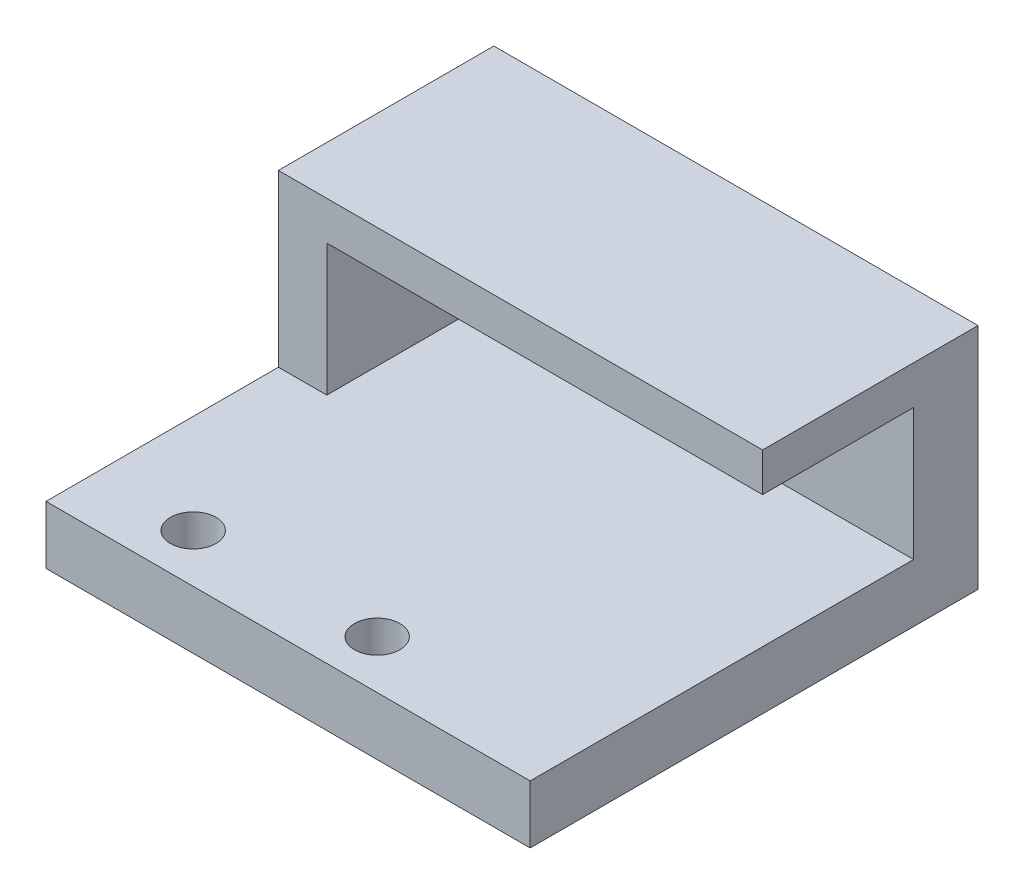
ISO-10303-21;
HEADER;
FILE_DESCRIPTION(('STEP AP214'),'2;1');
FILE_NAME('part.step','',(''),(''),'','','');
FILE_SCHEMA(('AUTOMOTIVE_DESIGN { 1 0 10303 214 1 1 1 1 }'));
ENDSEC;
DATA;
#1=APPLICATION_CONTEXT('core data for automotive mechanical design processes');
#2=APPLICATION_PROTOCOL_DEFINITION('international standard','automotive_design',2000,#1);
#3=PRODUCT_CONTEXT('',#1,'mechanical');
#4=PRODUCT('Part','Part','',(#3));
#5=PRODUCT_RELATED_PRODUCT_CATEGORY('part','',(#4));
#6=PRODUCT_DEFINITION_FORMATION('','',#4);
#7=PRODUCT_DEFINITION_CONTEXT('part definition',#1,'design');
#8=PRODUCT_DEFINITION('design','',#6,#7);
#9=PRODUCT_DEFINITION_SHAPE('','',#8);
#10=(LENGTH_UNIT() NAMED_UNIT(*) SI_UNIT(.MILLI.,.METRE.));
#11=(NAMED_UNIT(*) PLANE_ANGLE_UNIT() SI_UNIT($,.RADIAN.));
#12=(NAMED_UNIT(*) SI_UNIT($,.STERADIAN.) SOLID_ANGLE_UNIT());
#13=UNCERTAINTY_MEASURE_WITH_UNIT(LENGTH_MEASURE(1.E-05),#10,'distance_accuracy_value','');
#14=(GEOMETRIC_REPRESENTATION_CONTEXT(3) GLOBAL_UNCERTAINTY_ASSIGNED_CONTEXT((#13)) GLOBAL_UNIT_ASSIGNED_CONTEXT((#10,
#11,#12)) REPRESENTATION_CONTEXT('',''));
#15=CARTESIAN_POINT('',(0.,0.,0.));
#16=DIRECTION('',(0.,0.,1.));
#17=DIRECTION('',(1.,0.,0.));
#18=AXIS2_PLACEMENT_3D('',#15,#16,#17);
#19=CARTESIAN_POINT('',(0.,3.,0.));
#20=DIRECTION('',(0.,-1.,0.));
#21=DIRECTION('',(0.,0.,-1.));
#22=AXIS2_PLACEMENT_3D('',#19,#20,#21);
#23=PLANE('',#22);
#24=CARTESIAN_POINT('',(5.1,3.,-2.5));
#25=DIRECTION('',(0.,1.,0.));
#26=DIRECTION('',(0.,0.,1.));
#27=AXIS2_PLACEMENT_3D('',#24,#25,#26);
#28=CIRCLE('',#27,1.175);
#29=CARTESIAN_POINT('',(5.1,3.,-1.325));
#30=VERTEX_POINT('',#29);
#31=EDGE_CURVE('E203',#30,#30,#28,.T.);
#32=ORIENTED_EDGE('',*,*,#31,.F.);
#33=EDGE_LOOP('',(#32));
#34=FACE_BOUND('',#33,.T.);
#35=CARTESIAN_POINT('',(14.6,3.,-2.5));
#36=DIRECTION('',(0.,1.,0.));
#37=DIRECTION('',(0.,0.,1.));
#38=AXIS2_PLACEMENT_3D('',#35,#36,#37);
#39=CIRCLE('',#38,1.175);
#40=CARTESIAN_POINT('',(14.6,3.,-1.325));
#41=VERTEX_POINT('',#40);
#42=EDGE_CURVE('E195',#41,#41,#39,.T.);
#43=ORIENTED_EDGE('',*,*,#42,.F.);
#44=EDGE_LOOP('',(#43));
#45=FACE_BOUND('',#44,.T.);
#46=DIRECTION('',(-1.,0.,0.));
#47=VECTOR('',#46,1.);
#48=CARTESIAN_POINT('',(34.7590983190047,3.,-19.8));
#49=LINE('',#48,#47);
#50=CARTESIAN_POINT('',(25.,3.,-19.8));
#51=VERTEX_POINT('',#50);
#52=CARTESIAN_POINT('',(2.5,3.,-19.8));
#53=VERTEX_POINT('',#52);
#54=EDGE_CURVE('E166',#51,#53,#49,.T.);
#55=ORIENTED_EDGE('',*,*,#54,.T.);
#56=DIRECTION('',(0.,0.,-1.));
#57=VECTOR('',#56,1.);
#58=CARTESIAN_POINT('',(2.5,3.,-20.));
#59=LINE('',#58,#57);
#60=CARTESIAN_POINT('',(2.5,3.,-12.));
#61=VERTEX_POINT('',#60);
#62=EDGE_CURVE('E181',#61,#53,#59,.T.);
#63=ORIENTED_EDGE('',*,*,#62,.F.);
#64=DIRECTION('',(1.,0.,0.));
#65=VECTOR('',#64,1.);
#66=CARTESIAN_POINT('',(0.,3.,-12.));
#67=LINE('',#66,#65);
#68=CARTESIAN_POINT('',(0.,3.,-12.));
#69=VERTEX_POINT('',#68);
#70=EDGE_CURVE('E68',#69,#61,#67,.T.);
#71=ORIENTED_EDGE('',*,*,#70,.F.);
#72=DIRECTION('',(0.,0.,1.));
#73=VECTOR('',#72,1.);
#74=CARTESIAN_POINT('',(0.,3.,0.));
#75=LINE('',#74,#73);
#76=CARTESIAN_POINT('',(0.,3.,0.));
#77=VERTEX_POINT('',#76);
#78=EDGE_CURVE('E211',#69,#77,#75,.T.);
#79=ORIENTED_EDGE('',*,*,#78,.T.);
#80=DIRECTION('',(1.,0.,0.));
#81=VECTOR('',#80,1.);
#82=CARTESIAN_POINT('',(0.,3.,0.));
#83=LINE('',#82,#81);
#84=CARTESIAN_POINT('',(25.,3.,0.));
#85=VERTEX_POINT('',#84);
#86=EDGE_CURVE('E214',#77,#85,#83,.T.);
#87=ORIENTED_EDGE('',*,*,#86,.T.);
#88=DIRECTION('',(0.,0.,-1.));
#89=VECTOR('',#88,1.);
#90=CARTESIAN_POINT('',(25.,3.,0.));
#91=LINE('',#90,#89);
#92=EDGE_CURVE('E217',#85,#51,#91,.T.);
#93=ORIENTED_EDGE('',*,*,#92,.T.);
#94=EDGE_LOOP('',(#55,#63,#71,#79,#87,#93));
#95=FACE_BOUND('',#94,.T.);
#96=ADVANCED_FACE('F45',(#34,#45,#95),#23,.F.);
#97=CARTESIAN_POINT('',(2.5,9.8,-20.));
#98=DIRECTION('',(-1.,0.,0.));
#99=DIRECTION('',(0.,0.,1.));
#100=AXIS2_PLACEMENT_3D('',#97,#98,#99);
#101=PLANE('',#100);
#102=DIRECTION('',(0.,-1.,0.));
#103=VECTOR('',#102,1.);
#104=CARTESIAN_POINT('',(2.5,9.8,-19.8));
#105=LINE('',#104,#103);
#106=CARTESIAN_POINT('',(2.5,9.8,-19.8));
#107=VERTEX_POINT('',#106);
#108=CARTESIAN_POINT('',(2.5,6.4,-19.8));
#109=VERTEX_POINT('',#108);
#110=EDGE_CURVE('E163',#107,#109,#105,.T.);
#111=ORIENTED_EDGE('',*,*,#110,.F.);
#112=DIRECTION('',(0.,0.,-1.));
#113=VECTOR('',#112,1.);
#114=CARTESIAN_POINT('',(2.5,9.8,-20.));
#115=LINE('',#114,#113);
#116=CARTESIAN_POINT('',(2.5,9.8,-12.));
#117=VERTEX_POINT('',#116);
#118=EDGE_CURVE('E177',#117,#107,#115,.T.);
#119=ORIENTED_EDGE('',*,*,#118,.F.);
#120=DIRECTION('',(0.,-1.,0.));
#121=VECTOR('',#120,1.);
#122=CARTESIAN_POINT('',(2.5,9.8,-12.));
#123=LINE('',#122,#121);
#124=EDGE_CURVE('E180',#117,#61,#123,.T.);
#125=ORIENTED_EDGE('',*,*,#124,.T.);
#126=ORIENTED_EDGE('',*,*,#62,.T.);
#127=EDGE_CURVE('E144',#109,#53,#105,.T.);
#128=ORIENTED_EDGE('',*,*,#127,.F.);
#129=CARTESIAN_POINT('',(2.5,6.4,-18.));
#130=DIRECTION('',(-1.,0.,0.));
#131=DIRECTION('',(0.,0.,1.));
#132=AXIS2_PLACEMENT_3D('',#129,#130,#131);
#133=CIRCLE('',#132,1.8);
#134=EDGE_CURVE('E176',#109,#109,#133,.T.);
#135=ORIENTED_EDGE('',*,*,#134,.T.);
#136=EDGE_LOOP('',(#111,#119,#125,#126,#128,#135));
#137=FACE_BOUND('',#136,.T.);
#138=ADVANCED_FACE('F239',(#137),#101,.F.);
#139=CARTESIAN_POINT('',(0.,0.,0.));
#140=DIRECTION('',(0.,-1.,0.));
#141=DIRECTION('',(0.,0.,-1.));
#142=AXIS2_PLACEMENT_3D('',#139,#140,#141);
#143=PLANE('',#142);
#144=DIRECTION('',(1.,0.,0.));
#145=VECTOR('',#144,1.);
#146=CARTESIAN_POINT('',(-11.,0.,-23.1239864451254));
#147=LINE('',#146,#145);
#148=CARTESIAN_POINT('',(0.,0.,-23.1239864451254));
#149=VERTEX_POINT('',#148);
#150=CARTESIAN_POINT('',(25.,0.,-23.1239864451254));
#151=VERTEX_POINT('',#150);
#152=EDGE_CURVE('E133',#149,#151,#147,.T.);
#153=ORIENTED_EDGE('',*,*,#152,.T.);
#154=DIRECTION('',(0.,0.,-1.));
#155=VECTOR('',#154,1.);
#156=CARTESIAN_POINT('',(25.,0.,0.));
#157=LINE('',#156,#155);
#158=CARTESIAN_POINT('',(25.,0.,0.));
#159=VERTEX_POINT('',#158);
#160=EDGE_CURVE('E131',#159,#151,#157,.T.);
#161=ORIENTED_EDGE('',*,*,#160,.F.);
#162=DIRECTION('',(1.,0.,0.));
#163=VECTOR('',#162,1.);
#164=CARTESIAN_POINT('',(0.,0.,0.));
#165=LINE('',#164,#163);
#166=CARTESIAN_POINT('',(0.,0.,0.));
#167=VERTEX_POINT('',#166);
#168=EDGE_CURVE('E224',#167,#159,#165,.T.);
#169=ORIENTED_EDGE('',*,*,#168,.F.);
#170=DIRECTION('',(0.,0.,1.));
#171=VECTOR('',#170,1.);
#172=CARTESIAN_POINT('',(0.,0.,0.));
#173=LINE('',#172,#171);
#174=EDGE_CURVE('E207',#149,#167,#173,.T.);
#175=ORIENTED_EDGE('',*,*,#174,.F.);
#176=EDGE_LOOP('',(#153,#161,#169,#175));
#177=FACE_BOUND('',#176,.T.);
#178=CARTESIAN_POINT('',(5.1,0.,-2.5));
#179=DIRECTION('',(0.,1.,0.));
#180=DIRECTION('',(0.,0.,1.));
#181=AXIS2_PLACEMENT_3D('',#178,#179,#180);
#182=CIRCLE('',#181,1.175);
#183=CARTESIAN_POINT('',(5.1,0.,-1.325));
#184=VERTEX_POINT('',#183);
#185=EDGE_CURVE('E199',#184,#184,#182,.T.);
#186=ORIENTED_EDGE('',*,*,#185,.T.);
#187=EDGE_LOOP('',(#186));
#188=FACE_BOUND('',#187,.T.);
#189=CARTESIAN_POINT('',(14.6,0.,-2.5));
#190=DIRECTION('',(0.,1.,0.));
#191=DIRECTION('',(0.,0.,1.));
#192=AXIS2_PLACEMENT_3D('',#189,#190,#191);
#193=CIRCLE('',#192,1.175);
#194=CARTESIAN_POINT('',(14.6,0.,-1.325));
#195=VERTEX_POINT('',#194);
#196=EDGE_CURVE('E194',#195,#195,#193,.T.);
#197=ORIENTED_EDGE('',*,*,#196,.T.);
#198=EDGE_LOOP('',(#197));
#199=FACE_BOUND('',#198,.T.);
#200=ADVANCED_FACE('F265',(#177,#188,#199),#143,.T.);
#201=CARTESIAN_POINT('',(0.,3.,0.));
#202=DIRECTION('',(1.,0.,0.));
#203=DIRECTION('',(0.,0.,-1.));
#204=AXIS2_PLACEMENT_3D('',#201,#202,#203);
#205=PLANE('',#204);
#206=CARTESIAN_POINT('',(0.,6.4,-18.));
#207=DIRECTION('',(-1.,0.,0.));
#208=DIRECTION('',(0.,0.,1.));
#209=AXIS2_PLACEMENT_3D('',#206,#207,#208);
#210=CIRCLE('',#209,1.8);
#211=CARTESIAN_POINT('',(0.,6.4,-16.2));
#212=VERTEX_POINT('',#211);
#213=EDGE_CURVE('E161',#212,#212,#210,.T.);
#214=ORIENTED_EDGE('',*,*,#213,.F.);
#215=EDGE_LOOP('',(#214));
#216=FACE_BOUND('',#215,.T.);
#217=DIRECTION('',(0.,0.,1.));
#218=VECTOR('',#217,1.);
#219=CARTESIAN_POINT('',(0.,11.8,-12.));
#220=LINE('',#219,#218);
#221=CARTESIAN_POINT('',(0.,11.8,-23.1239864451254));
#222=VERTEX_POINT('',#221);
#223=CARTESIAN_POINT('',(0.,11.8,-12.));
#224=VERTEX_POINT('',#223);
#225=EDGE_CURVE('E146',#222,#224,#220,.T.);
#226=ORIENTED_EDGE('',*,*,#225,.F.);
#227=DIRECTION('',(0.,-1.,0.));
#228=VECTOR('',#227,1.);
#229=CARTESIAN_POINT('',(0.,3.,-23.1239864451254));
#230=LINE('',#229,#228);
#231=EDGE_CURVE('E61',#222,#149,#230,.T.);
#232=ORIENTED_EDGE('',*,*,#231,.T.);
#233=ORIENTED_EDGE('',*,*,#174,.T.);
#234=DIRECTION('',(0.,-1.,0.));
#235=VECTOR('',#234,1.);
#236=CARTESIAN_POINT('',(0.,3.,0.));
#237=LINE('',#236,#235);
#238=EDGE_CURVE('E54',#77,#167,#237,.T.);
#239=ORIENTED_EDGE('',*,*,#238,.F.);
#240=ORIENTED_EDGE('',*,*,#78,.F.);
#241=DIRECTION('',(0.,-1.,0.));
#242=VECTOR('',#241,1.);
#243=CARTESIAN_POINT('',(0.,9.8,-12.));
#244=LINE('',#243,#242);
#245=EDGE_CURVE('E190',#224,#69,#244,.T.);
#246=ORIENTED_EDGE('',*,*,#245,.F.);
#247=EDGE_LOOP('',(#226,#232,#233,#239,#240,#246));
#248=FACE_BOUND('',#247,.T.);
#249=ADVANCED_FACE('F47',(#216,#248),#205,.F.);
#250=CARTESIAN_POINT('',(0.,3.,0.));
#251=DIRECTION('',(0.,0.,-1.));
#252=DIRECTION('',(-1.,0.,0.));
#253=AXIS2_PLACEMENT_3D('',#250,#251,#252);
#254=PLANE('',#253);
#255=ORIENTED_EDGE('',*,*,#168,.T.);
#256=DIRECTION('',(0.,-1.,0.));
#257=VECTOR('',#256,1.);
#258=CARTESIAN_POINT('',(25.,3.,0.));
#259=LINE('',#258,#257);
#260=EDGE_CURVE('E221',#85,#159,#259,.T.);
#261=ORIENTED_EDGE('',*,*,#260,.F.);
#262=ORIENTED_EDGE('',*,*,#86,.F.);
#263=ORIENTED_EDGE('',*,*,#238,.T.);
#264=EDGE_LOOP('',(#255,#261,#262,#263));
#265=FACE_BOUND('',#264,.T.);
#266=ADVANCED_FACE('F276',(#265),#254,.F.);
#267=CARTESIAN_POINT('',(25.,3.,0.));
#268=DIRECTION('',(-1.,0.,0.));
#269=DIRECTION('',(0.,0.,1.));
#270=AXIS2_PLACEMENT_3D('',#267,#268,#269);
#271=PLANE('',#270);
#272=ORIENTED_EDGE('',*,*,#160,.T.);
#273=DIRECTION('',(0.,-1.,0.));
#274=VECTOR('',#273,1.);
#275=CARTESIAN_POINT('',(25.,11.8,-23.1239864451254));
#276=LINE('',#275,#274);
#277=CARTESIAN_POINT('',(25.,11.8,-23.1239864451254));
#278=VERTEX_POINT('',#277);
#279=EDGE_CURVE('E118',#278,#151,#276,.T.);
#280=ORIENTED_EDGE('',*,*,#279,.F.);
#281=DIRECTION('',(0.,0.,-1.));
#282=VECTOR('',#281,1.);
#283=CARTESIAN_POINT('',(25.,11.8,-12.));
#284=LINE('',#283,#282);
#285=CARTESIAN_POINT('',(25.,11.8,-12.));
#286=VERTEX_POINT('',#285);
#287=EDGE_CURVE('E128',#286,#278,#284,.T.);
#288=ORIENTED_EDGE('',*,*,#287,.F.);
#289=DIRECTION('',(0.,-1.,0.));
#290=VECTOR('',#289,1.);
#291=CARTESIAN_POINT('',(25.,11.8,-12.));
#292=LINE('',#291,#290);
#293=CARTESIAN_POINT('',(25.,9.8,-12.));
#294=VERTEX_POINT('',#293);
#295=EDGE_CURVE('E140',#286,#294,#292,.T.);
#296=ORIENTED_EDGE('',*,*,#295,.T.);
#297=DIRECTION('',(0.,0.,-1.));
#298=VECTOR('',#297,1.);
#299=CARTESIAN_POINT('',(25.,9.8,-12.));
#300=LINE('',#299,#298);
#301=CARTESIAN_POINT('',(25.,9.8,-19.8));
#302=VERTEX_POINT('',#301);
#303=EDGE_CURVE('E153',#294,#302,#300,.T.);
#304=ORIENTED_EDGE('',*,*,#303,.T.);
#305=DIRECTION('',(0.,1.,0.));
#306=VECTOR('',#305,1.);
#307=CARTESIAN_POINT('',(25.,9.8,-19.8));
#308=LINE('',#307,#306);
#309=EDGE_CURVE('E157',#51,#302,#308,.T.);
#310=ORIENTED_EDGE('',*,*,#309,.F.);
#311=ORIENTED_EDGE('',*,*,#92,.F.);
#312=ORIENTED_EDGE('',*,*,#260,.T.);
#313=EDGE_LOOP('',(#272,#280,#288,#296,#304,#310,#311,#312));
#314=FACE_BOUND('',#313,.T.);
#315=ADVANCED_FACE('F126',(#314),#271,.F.);
#316=CARTESIAN_POINT('',(5.1,3.,-2.5));
#317=DIRECTION('',(0.,-1.,0.));
#318=DIRECTION('',(0.,0.,-1.));
#319=AXIS2_PLACEMENT_3D('',#316,#317,#318);
#320=CYLINDRICAL_SURFACE('',#319,1.175);
#321=ORIENTED_EDGE('',*,*,#31,.T.);
#322=EDGE_LOOP('',(#321));
#323=FACE_BOUND('',#322,.T.);
#324=ORIENTED_EDGE('',*,*,#185,.F.);
#325=EDGE_LOOP('',(#324));
#326=FACE_BOUND('',#325,.T.);
#327=ADVANCED_FACE('F270',(#323,#326),#320,.F.);
#328=CARTESIAN_POINT('',(14.6,3.,-2.5));
#329=DIRECTION('',(0.,-1.,0.));
#330=DIRECTION('',(0.,0.,-1.));
#331=AXIS2_PLACEMENT_3D('',#328,#329,#330);
#332=CYLINDRICAL_SURFACE('',#331,1.175);
#333=ORIENTED_EDGE('',*,*,#42,.T.);
#334=EDGE_LOOP('',(#333));
#335=FACE_BOUND('',#334,.T.);
#336=ORIENTED_EDGE('',*,*,#196,.F.);
#337=EDGE_LOOP('',(#336));
#338=FACE_BOUND('',#337,.T.);
#339=ADVANCED_FACE('F256',(#335,#338),#332,.F.);
#340=CARTESIAN_POINT('',(0.,9.8,-12.));
#341=DIRECTION('',(0.,0.,-1.));
#342=DIRECTION('',(-1.,0.,0.));
#343=AXIS2_PLACEMENT_3D('',#340,#341,#342);
#344=PLANE('',#343);
#345=ORIENTED_EDGE('',*,*,#70,.T.);
#346=ORIENTED_EDGE('',*,*,#124,.F.);
#347=DIRECTION('',(1.,0.,0.));
#348=VECTOR('',#347,1.);
#349=CARTESIAN_POINT('',(0.,9.8,-12.));
#350=LINE('',#349,#348);
#351=EDGE_CURVE('E150',#117,#294,#350,.T.);
#352=ORIENTED_EDGE('',*,*,#351,.T.);
#353=ORIENTED_EDGE('',*,*,#295,.F.);
#354=DIRECTION('',(1.,0.,0.));
#355=VECTOR('',#354,1.);
#356=CARTESIAN_POINT('',(0.,11.8,-12.));
#357=LINE('',#356,#355);
#358=EDGE_CURVE('E137',#224,#286,#357,.T.);
#359=ORIENTED_EDGE('',*,*,#358,.F.);
#360=ORIENTED_EDGE('',*,*,#245,.T.);
#361=EDGE_LOOP('',(#345,#346,#352,#353,#359,#360));
#362=FACE_BOUND('',#361,.T.);
#363=ADVANCED_FACE('F245',(#362),#344,.F.);
#364=CARTESIAN_POINT('',(6.8,6.4,-18.));
#365=DIRECTION('',(-1.,0.,0.));
#366=DIRECTION('',(0.,0.,1.));
#367=AXIS2_PLACEMENT_3D('',#364,#365,#366);
#368=CYLINDRICAL_SURFACE('',#367,1.8);
#369=ORIENTED_EDGE('',*,*,#213,.T.);
#370=EDGE_LOOP('',(#369));
#371=FACE_BOUND('',#370,.T.);
#372=ORIENTED_EDGE('',*,*,#134,.F.);
#373=EDGE_LOOP('',(#372));
#374=FACE_BOUND('',#373,.T.);
#375=ADVANCED_FACE('F242',(#371,#374),#368,.F.);
#376=CARTESIAN_POINT('',(34.7590983190047,9.8,-19.8));
#377=DIRECTION('',(0.,0.,-1.));
#378=DIRECTION('',(-1.,0.,0.));
#379=AXIS2_PLACEMENT_3D('',#376,#377,#378);
#380=PLANE('',#379);
#381=ORIENTED_EDGE('',*,*,#54,.F.);
#382=ORIENTED_EDGE('',*,*,#309,.T.);
#383=DIRECTION('',(-1.,0.,0.));
#384=VECTOR('',#383,1.);
#385=CARTESIAN_POINT('',(34.7590983190047,9.8,-19.8));
#386=LINE('',#385,#384);
#387=EDGE_CURVE('E162',#302,#107,#386,.T.);
#388=ORIENTED_EDGE('',*,*,#387,.T.);
#389=ORIENTED_EDGE('',*,*,#110,.T.);
#390=ORIENTED_EDGE('',*,*,#127,.T.);
#391=EDGE_LOOP('',(#381,#382,#388,#389,#390));
#392=FACE_BOUND('',#391,.T.);
#393=ADVANCED_FACE('F244',(#392),#380,.F.);
#394=CARTESIAN_POINT('',(0.,11.8,0.));
#395=DIRECTION('',(0.,-1.,0.));
#396=DIRECTION('',(0.,0.,-1.));
#397=AXIS2_PLACEMENT_3D('',#394,#395,#396);
#398=PLANE('',#397);
#399=ORIENTED_EDGE('',*,*,#287,.T.);
#400=DIRECTION('',(-1.,0.,0.));
#401=VECTOR('',#400,1.);
#402=CARTESIAN_POINT('',(0.,11.8,-23.1239864451254));
#403=LINE('',#402,#401);
#404=EDGE_CURVE('E11',#278,#222,#403,.T.);
#405=ORIENTED_EDGE('',*,*,#404,.T.);
#406=ORIENTED_EDGE('',*,*,#225,.T.);
#407=ORIENTED_EDGE('',*,*,#358,.T.);
#408=EDGE_LOOP('',(#399,#405,#406,#407));
#409=FACE_BOUND('',#408,.T.);
#410=ADVANCED_FACE('F135',(#409),#398,.F.);
#411=CARTESIAN_POINT('',(0.,9.8,0.));
#412=DIRECTION('',(0.,-1.,0.));
#413=DIRECTION('',(0.,0.,-1.));
#414=AXIS2_PLACEMENT_3D('',#411,#412,#413);
#415=PLANE('',#414);
#416=ORIENTED_EDGE('',*,*,#351,.F.);
#417=ORIENTED_EDGE('',*,*,#118,.T.);
#418=ORIENTED_EDGE('',*,*,#387,.F.);
#419=ORIENTED_EDGE('',*,*,#303,.F.);
#420=EDGE_LOOP('',(#416,#417,#418,#419));
#421=FACE_BOUND('',#420,.T.);
#422=ADVANCED_FACE('F301',(#421),#415,.T.);
#423=CARTESIAN_POINT('',(-11.,11.8,-23.1239864451254));
#424=DIRECTION('',(0.,0.,1.));
#425=DIRECTION('',(1.,0.,0.));
#426=AXIS2_PLACEMENT_3D('',#423,#424,#425);
#427=PLANE('',#426);
#428=ORIENTED_EDGE('',*,*,#404,.F.);
#429=ORIENTED_EDGE('',*,*,#279,.T.);
#430=ORIENTED_EDGE('',*,*,#152,.F.);
#431=ORIENTED_EDGE('',*,*,#231,.F.);
#432=EDGE_LOOP('',(#428,#429,#430,#431));
#433=FACE_BOUND('',#432,.T.);
#434=ADVANCED_FACE('F117',(#433),#427,.F.);
#435=CLOSED_SHELL('',(#96,#138,#200,#249,#266,#315,#327,#339,#363,#375,#393,#410,#422,#434));
#436=MANIFOLD_SOLID_BREP('B2',#435);
#437=ADVANCED_BREP_SHAPE_REPRESENTATION('',(#18,#436),#14);
#438=SHAPE_DEFINITION_REPRESENTATION(#9,#437);
ENDSEC;
END-ISO-10303-21;
